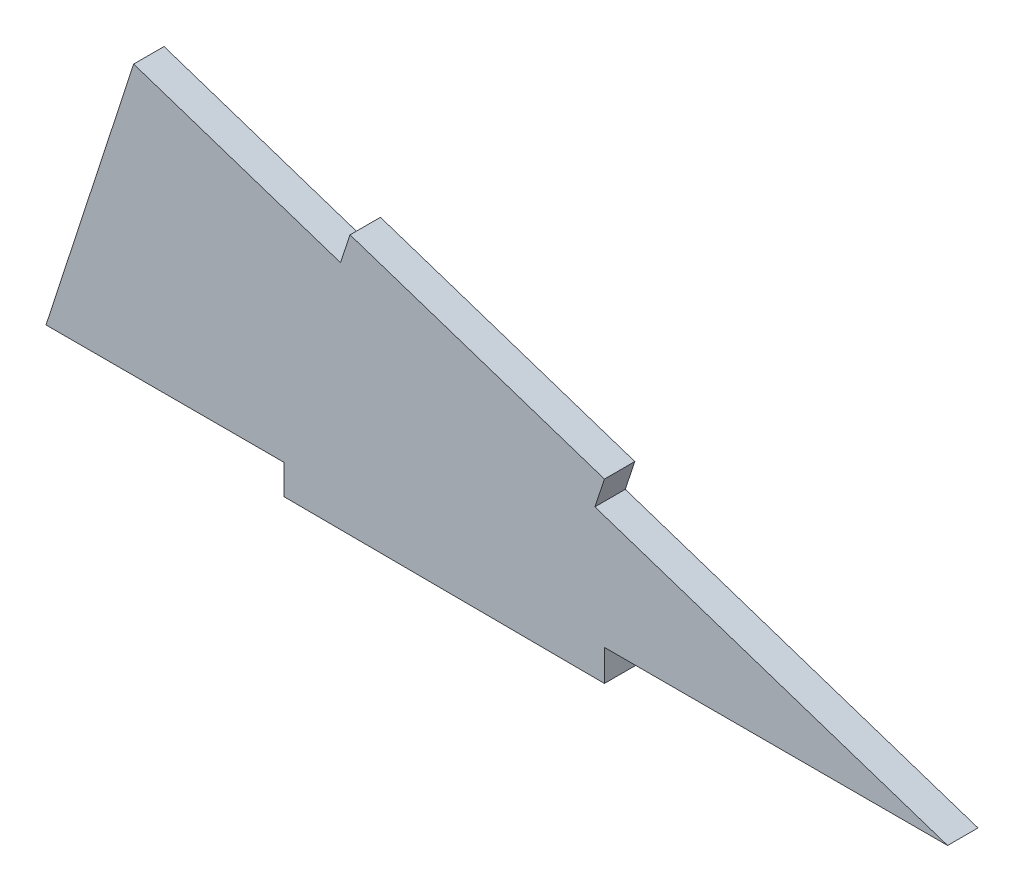
ISO-10303-21;
HEADER;
FILE_DESCRIPTION(('STEP AP214'),'2;1');
FILE_NAME('part.step','',(''),(''),'','','');
FILE_SCHEMA(('AUTOMOTIVE_DESIGN { 1 0 10303 214 1 1 1 1 }'));
ENDSEC;
DATA;
#1=APPLICATION_CONTEXT('core data for automotive mechanical design processes');
#2=APPLICATION_PROTOCOL_DEFINITION('international standard','automotive_design',2000,#1);
#3=PRODUCT_CONTEXT('',#1,'mechanical');
#4=PRODUCT('Part','Part','',(#3));
#5=PRODUCT_RELATED_PRODUCT_CATEGORY('part','',(#4));
#6=PRODUCT_DEFINITION_FORMATION('','',#4);
#7=PRODUCT_DEFINITION_CONTEXT('part definition',#1,'design');
#8=PRODUCT_DEFINITION('design','',#6,#7);
#9=PRODUCT_DEFINITION_SHAPE('','',#8);
#10=(LENGTH_UNIT() NAMED_UNIT(*) SI_UNIT(.MILLI.,.METRE.));
#11=(NAMED_UNIT(*) PLANE_ANGLE_UNIT() SI_UNIT($,.RADIAN.));
#12=(NAMED_UNIT(*) SI_UNIT($,.STERADIAN.) SOLID_ANGLE_UNIT());
#13=UNCERTAINTY_MEASURE_WITH_UNIT(LENGTH_MEASURE(1.E-05),#10,'distance_accuracy_value','');
#14=(GEOMETRIC_REPRESENTATION_CONTEXT(3) GLOBAL_UNCERTAINTY_ASSIGNED_CONTEXT((#13)) GLOBAL_UNIT_ASSIGNED_CONTEXT((#10,
#11,#12)) REPRESENTATION_CONTEXT('',''));
#15=CARTESIAN_POINT('',(0.,0.,0.));
#16=DIRECTION('',(0.,0.,1.));
#17=DIRECTION('',(1.,0.,0.));
#18=AXIS2_PLACEMENT_3D('',#15,#16,#17);
#19=CARTESIAN_POINT('',(-80.3475241575014,26.6295824562643,3.));
#20=DIRECTION('',(-0.314601307837959,-0.949223902515442,0.));
#21=DIRECTION('',(0.949223902515442,-0.314601307837959,0.));
#22=AXIS2_PLACEMENT_3D('',#19,#20,#21);
#23=PLANE('',#22);
#24=DIRECTION('',(-0.949223902515442,0.314601307837959,0.));
#25=VECTOR('',#24,1.);
#26=CARTESIAN_POINT('',(-80.3475241575014,26.6295824562643,3.));
#27=LINE('',#26,#25);
#28=CARTESIAN_POINT('',(-59.9311167076422,19.8629718936169,3.));
#29=VERTEX_POINT('',#28);
#30=CARTESIAN_POINT('',(-80.3475241575014,26.6295824562643,3.));
#31=VERTEX_POINT('',#30);
#32=EDGE_CURVE('E48',#29,#31,#27,.T.);
#33=ORIENTED_EDGE('',*,*,#32,.F.);
#34=DIRECTION('',(0.,0.,1.));
#35=VECTOR('',#34,1.);
#36=CARTESIAN_POINT('',(-59.9311167076422,19.8629718936169,0.));
#37=LINE('',#36,#35);
#38=CARTESIAN_POINT('',(-59.9311167076422,19.8629718936169,0.));
#39=VERTEX_POINT('',#38);
#40=EDGE_CURVE('E149',#39,#29,#37,.T.);
#41=ORIENTED_EDGE('',*,*,#40,.F.);
#42=DIRECTION('',(-0.949223902515442,0.314601307837959,0.));
#43=VECTOR('',#42,1.);
#44=CARTESIAN_POINT('',(-80.3475241575014,26.6295824562643,0.));
#45=LINE('',#44,#43);
#46=CARTESIAN_POINT('',(-80.3475241575014,26.6295824562643,0.));
#47=VERTEX_POINT('',#46);
#48=EDGE_CURVE('E173',#39,#47,#45,.T.);
#49=ORIENTED_EDGE('',*,*,#48,.T.);
#50=DIRECTION('',(0.,0.,-1.));
#51=VECTOR('',#50,1.);
#52=CARTESIAN_POINT('',(-80.3475241575014,26.6295824562643,3.));
#53=LINE('',#52,#51);
#54=EDGE_CURVE('E11',#31,#47,#53,.T.);
#55=ORIENTED_EDGE('',*,*,#54,.F.);
#56=EDGE_LOOP('',(#33,#41,#49,#55));
#57=FACE_BOUND('',#56,.T.);
#58=ADVANCED_FACE('F33',(#57),#23,.F.);
#59=CARTESIAN_POINT('',(0.,0.,3.));
#60=DIRECTION('',(0.,1.,0.));
#61=DIRECTION('',(-1.,0.,0.));
#62=AXIS2_PLACEMENT_3D('',#59,#60,#61);
#63=PLANE('',#62);
#64=DIRECTION('',(0.,0.,1.));
#65=VECTOR('',#64,1.);
#66=CARTESIAN_POINT('',(-33.8743450637499,0.,0.));
#67=LINE('',#66,#65);
#68=CARTESIAN_POINT('',(-33.8743450637499,0.,0.));
#69=VERTEX_POINT('',#68);
#70=CARTESIAN_POINT('',(-33.8743450637499,0.,3.));
#71=VERTEX_POINT('',#70);
#72=EDGE_CURVE('E171',#69,#71,#67,.T.);
#73=ORIENTED_EDGE('',*,*,#72,.F.);
#74=DIRECTION('',(1.,0.,0.));
#75=VECTOR('',#74,1.);
#76=CARTESIAN_POINT('',(0.,0.,0.));
#77=LINE('',#76,#75);
#78=CARTESIAN_POINT('',(0.,0.,0.));
#79=VERTEX_POINT('',#78);
#80=EDGE_CURVE('E193',#69,#79,#77,.T.);
#81=ORIENTED_EDGE('',*,*,#80,.T.);
#82=DIRECTION('',(0.,0.,-1.));
#83=VECTOR('',#82,1.);
#84=CARTESIAN_POINT('',(0.,0.,3.));
#85=LINE('',#84,#83);
#86=CARTESIAN_POINT('',(0.,0.,3.));
#87=VERTEX_POINT('',#86);
#88=EDGE_CURVE('E188',#87,#79,#85,.T.);
#89=ORIENTED_EDGE('',*,*,#88,.F.);
#90=DIRECTION('',(1.,0.,0.));
#91=VECTOR('',#90,1.);
#92=CARTESIAN_POINT('',(0.,0.,3.));
#93=LINE('',#92,#91);
#94=EDGE_CURVE('E184',#71,#87,#93,.T.);
#95=ORIENTED_EDGE('',*,*,#94,.F.);
#96=EDGE_LOOP('',(#73,#81,#89,#95));
#97=FACE_BOUND('',#96,.T.);
#98=ADVANCED_FACE('F224',(#97),#63,.F.);
#99=CARTESIAN_POINT('',(-34.8181489872637,11.5397802129323,0.));
#100=VERTEX_POINT('',#99);
#101=EDGE_CURVE('E189',#79,#100,#45,.T.);
#102=ORIENTED_EDGE('',*,*,#101,.T.);
#103=DIRECTION('',(0.,0.,1.));
#104=VECTOR('',#103,1.);
#105=CARTESIAN_POINT('',(-34.8181489872638,11.5397802129323,0.));
#106=LINE('',#105,#104);
#107=CARTESIAN_POINT('',(-34.8181489872637,11.5397802129323,3.));
#108=VERTEX_POINT('',#107);
#109=EDGE_CURVE('E56',#100,#108,#106,.T.);
#110=ORIENTED_EDGE('',*,*,#109,.T.);
#111=EDGE_CURVE('E180',#87,#108,#27,.T.);
#112=ORIENTED_EDGE('',*,*,#111,.F.);
#113=ORIENTED_EDGE('',*,*,#88,.T.);
#114=EDGE_LOOP('',(#102,#110,#112,#113));
#115=FACE_BOUND('',#114,.T.);
#116=ADVANCED_FACE('F35',(#115),#23,.F.);
#117=CARTESIAN_POINT('',(-89.,0.,3.));
#118=DIRECTION('',(0.951056516295152,-0.309016994374952,0.));
#119=DIRECTION('',(0.309016994374952,0.951056516295152,0.));
#120=AXIS2_PLACEMENT_3D('',#117,#118,#119);
#121=PLANE('',#120);
#122=DIRECTION('',(-0.309016994374952,-0.951056516295152,0.));
#123=VECTOR('',#122,1.);
#124=CARTESIAN_POINT('',(-89.,0.,0.));
#125=LINE('',#124,#123);
#126=CARTESIAN_POINT('',(-89.,0.,0.));
#127=VERTEX_POINT('',#126);
#128=EDGE_CURVE('E191',#47,#127,#125,.T.);
#129=ORIENTED_EDGE('',*,*,#128,.T.);
#130=DIRECTION('',(0.,0.,-1.));
#131=VECTOR('',#130,1.);
#132=CARTESIAN_POINT('',(-89.,0.,3.));
#133=LINE('',#132,#131);
#134=CARTESIAN_POINT('',(-89.,0.,3.));
#135=VERTEX_POINT('',#134);
#136=EDGE_CURVE('E41',#135,#127,#133,.T.);
#137=ORIENTED_EDGE('',*,*,#136,.F.);
#138=DIRECTION('',(-0.309016994374952,-0.951056516295152,0.));
#139=VECTOR('',#138,1.);
#140=CARTESIAN_POINT('',(-89.,0.,3.));
#141=LINE('',#140,#139);
#142=EDGE_CURVE('E182',#31,#135,#141,.T.);
#143=ORIENTED_EDGE('',*,*,#142,.F.);
#144=ORIENTED_EDGE('',*,*,#54,.T.);
#145=EDGE_LOOP('',(#129,#137,#143,#144));
#146=FACE_BOUND('',#145,.T.);
#147=ADVANCED_FACE('F215',(#146),#121,.F.);
#148=CARTESIAN_POINT('',(-65.5271895856265,0.,0.));
#149=VERTEX_POINT('',#148);
#150=EDGE_CURVE('E194',#127,#149,#77,.T.);
#151=ORIENTED_EDGE('',*,*,#150,.T.);
#152=DIRECTION('',(0.,0.,1.));
#153=VECTOR('',#152,1.);
#154=CARTESIAN_POINT('',(-65.5271895856265,0.,0.));
#155=LINE('',#154,#153);
#156=CARTESIAN_POINT('',(-65.5271895856265,0.,3.));
#157=VERTEX_POINT('',#156);
#158=EDGE_CURVE('E163',#149,#157,#155,.T.);
#159=ORIENTED_EDGE('',*,*,#158,.T.);
#160=EDGE_CURVE('E185',#135,#157,#93,.T.);
#161=ORIENTED_EDGE('',*,*,#160,.F.);
#162=ORIENTED_EDGE('',*,*,#136,.T.);
#163=EDGE_LOOP('',(#151,#159,#161,#162));
#164=FACE_BOUND('',#163,.T.);
#165=ADVANCED_FACE('F203',(#164),#63,.F.);
#166=CARTESIAN_POINT('',(0.,0.,3.));
#167=DIRECTION('',(0.,0.,1.));
#168=DIRECTION('',(1.,0.,0.));
#169=AXIS2_PLACEMENT_3D('',#166,#167,#168);
#170=PLANE('',#169);
#171=ORIENTED_EDGE('',*,*,#111,.T.);
#172=DIRECTION('',(0.314601307837959,0.949223902515442,0.));
#173=VECTOR('',#172,1.);
#174=CARTESIAN_POINT('',(-33.8743450637499,14.3874519204786,3.));
#175=LINE('',#174,#173);
#176=CARTESIAN_POINT('',(-33.8743450637499,14.3874519204786,3.));
#177=VERTEX_POINT('',#176);
#178=EDGE_CURVE('E146',#108,#177,#175,.T.);
#179=ORIENTED_EDGE('',*,*,#178,.T.);
#180=DIRECTION('',(-0.949223902515442,0.314601307837959,0.));
#181=VECTOR('',#180,1.);
#182=CARTESIAN_POINT('',(-58.9873127841283,22.7106436011632,3.));
#183=LINE('',#182,#181);
#184=CARTESIAN_POINT('',(-58.9873127841283,22.7106436011632,3.));
#185=VERTEX_POINT('',#184);
#186=EDGE_CURVE('E124',#177,#185,#183,.T.);
#187=ORIENTED_EDGE('',*,*,#186,.T.);
#188=DIRECTION('',(-0.314601307837959,-0.949223902515442,0.));
#189=VECTOR('',#188,1.);
#190=CARTESIAN_POINT('',(-59.9311167076422,19.8629718936169,3.));
#191=LINE('',#190,#189);
#192=EDGE_CURVE('E140',#185,#29,#191,.T.);
#193=ORIENTED_EDGE('',*,*,#192,.T.);
#194=ORIENTED_EDGE('',*,*,#32,.T.);
#195=ORIENTED_EDGE('',*,*,#142,.T.);
#196=ORIENTED_EDGE('',*,*,#160,.T.);
#197=DIRECTION('',(0.,-1.,0.));
#198=VECTOR('',#197,1.);
#199=CARTESIAN_POINT('',(-65.5271895856265,0.,3.));
#200=LINE('',#199,#198);
#201=CARTESIAN_POINT('',(-65.5271895856265,-2.93386052175866,3.));
#202=VERTEX_POINT('',#201);
#203=EDGE_CURVE('E151',#157,#202,#200,.T.);
#204=ORIENTED_EDGE('',*,*,#203,.T.);
#205=DIRECTION('',(0.999988265666315,-0.00484443285385099,0.));
#206=VECTOR('',#205,1.);
#207=CARTESIAN_POINT('',(-65.5271895856265,-2.93386052175866,3.));
#208=LINE('',#207,#206);
#209=CARTESIAN_POINT('',(-33.8743450637499,-3.08720240104305,3.));
#210=VERTEX_POINT('',#209);
#211=EDGE_CURVE('E166',#202,#210,#208,.T.);
#212=ORIENTED_EDGE('',*,*,#211,.T.);
#213=DIRECTION('',(0.,1.,0.));
#214=VECTOR('',#213,1.);
#215=CARTESIAN_POINT('',(-33.8743450637499,-3.08720240104305,3.));
#216=LINE('',#215,#214);
#217=EDGE_CURVE('E158',#210,#71,#216,.T.);
#218=ORIENTED_EDGE('',*,*,#217,.T.);
#219=ORIENTED_EDGE('',*,*,#94,.T.);
#220=EDGE_LOOP('',(#171,#179,#187,#193,#194,#195,#196,#204,#212,#218,#219));
#221=FACE_BOUND('',#220,.T.);
#222=ADVANCED_FACE('F214',(#221),#170,.T.);
#223=CARTESIAN_POINT('',(0.,0.,0.));
#224=DIRECTION('',(0.,0.,1.));
#225=DIRECTION('',(1.,0.,0.));
#226=AXIS2_PLACEMENT_3D('',#223,#224,#225);
#227=PLANE('',#226);
#228=ORIENTED_EDGE('',*,*,#101,.F.);
#229=ORIENTED_EDGE('',*,*,#80,.F.);
#230=DIRECTION('',(0.,1.,0.));
#231=VECTOR('',#230,1.);
#232=CARTESIAN_POINT('',(-33.8743450637499,-3.08720240104305,0.));
#233=LINE('',#232,#231);
#234=CARTESIAN_POINT('',(-33.8743450637499,-3.08720240104305,0.));
#235=VERTEX_POINT('',#234);
#236=EDGE_CURVE('E161',#235,#69,#233,.T.);
#237=ORIENTED_EDGE('',*,*,#236,.F.);
#238=DIRECTION('',(0.999988265666315,-0.00484443285385099,0.));
#239=VECTOR('',#238,1.);
#240=CARTESIAN_POINT('',(-65.5271895856265,-2.93386052175866,0.));
#241=LINE('',#240,#239);
#242=CARTESIAN_POINT('',(-65.5271895856265,-2.93386052175866,0.));
#243=VERTEX_POINT('',#242);
#244=EDGE_CURVE('E157',#243,#235,#241,.T.);
#245=ORIENTED_EDGE('',*,*,#244,.F.);
#246=DIRECTION('',(0.,-1.,0.));
#247=VECTOR('',#246,1.);
#248=CARTESIAN_POINT('',(-65.5271895856265,0.,0.));
#249=LINE('',#248,#247);
#250=EDGE_CURVE('E154',#149,#243,#249,.T.);
#251=ORIENTED_EDGE('',*,*,#250,.F.);
#252=ORIENTED_EDGE('',*,*,#150,.F.);
#253=ORIENTED_EDGE('',*,*,#128,.F.);
#254=ORIENTED_EDGE('',*,*,#48,.F.);
#255=DIRECTION('',(-0.314601307837959,-0.949223902515442,0.));
#256=VECTOR('',#255,1.);
#257=CARTESIAN_POINT('',(-59.9311167076422,19.8629718936169,0.));
#258=LINE('',#257,#256);
#259=CARTESIAN_POINT('',(-58.9873127841283,22.7106436011632,0.));
#260=VERTEX_POINT('',#259);
#261=EDGE_CURVE('E137',#260,#39,#258,.T.);
#262=ORIENTED_EDGE('',*,*,#261,.F.);
#263=DIRECTION('',(-0.949223902515442,0.314601307837959,0.));
#264=VECTOR('',#263,1.);
#265=CARTESIAN_POINT('',(-58.9873127841283,22.7106436011632,0.));
#266=LINE('',#265,#264);
#267=CARTESIAN_POINT('',(-33.8743450637499,14.3874519204786,0.));
#268=VERTEX_POINT('',#267);
#269=EDGE_CURVE('E121',#268,#260,#266,.T.);
#270=ORIENTED_EDGE('',*,*,#269,.F.);
#271=DIRECTION('',(0.314601307837959,0.949223902515442,0.));
#272=VECTOR('',#271,1.);
#273=CARTESIAN_POINT('',(-33.8743450637499,14.3874519204786,0.));
#274=LINE('',#273,#272);
#275=EDGE_CURVE('E135',#100,#268,#274,.T.);
#276=ORIENTED_EDGE('',*,*,#275,.F.);
#277=EDGE_LOOP('',(#228,#229,#237,#245,#251,#252,#253,#254,#262,#270,#276));
#278=FACE_BOUND('',#277,.T.);
#279=ADVANCED_FACE('F134',(#278),#227,.F.);
#280=CARTESIAN_POINT('',(-33.8743450637499,-3.08720240104305,0.));
#281=DIRECTION('',(1.,0.,0.));
#282=DIRECTION('',(0.,0.,-1.));
#283=AXIS2_PLACEMENT_3D('',#280,#281,#282);
#284=PLANE('',#283);
#285=ORIENTED_EDGE('',*,*,#217,.F.);
#286=DIRECTION('',(0.,0.,1.));
#287=VECTOR('',#286,1.);
#288=CARTESIAN_POINT('',(-33.8743450637499,-3.08720240104305,0.));
#289=LINE('',#288,#287);
#290=EDGE_CURVE('E174',#235,#210,#289,.T.);
#291=ORIENTED_EDGE('',*,*,#290,.F.);
#292=ORIENTED_EDGE('',*,*,#236,.T.);
#293=ORIENTED_EDGE('',*,*,#72,.T.);
#294=EDGE_LOOP('',(#285,#291,#292,#293));
#295=FACE_BOUND('',#294,.T.);
#296=ADVANCED_FACE('F227',(#295),#284,.T.);
#297=CARTESIAN_POINT('',(-65.5271895856265,-2.93386052175866,0.));
#298=DIRECTION('',(-0.00484443285385099,-0.999988265666315,0.));
#299=DIRECTION('',(0.999988265666315,-0.00484443285385099,0.));
#300=AXIS2_PLACEMENT_3D('',#297,#298,#299);
#301=PLANE('',#300);
#302=ORIENTED_EDGE('',*,*,#211,.F.);
#303=DIRECTION('',(0.,0.,1.));
#304=VECTOR('',#303,1.);
#305=CARTESIAN_POINT('',(-65.5271895856265,-2.93386052175866,0.));
#306=LINE('',#305,#304);
#307=EDGE_CURVE('E176',#243,#202,#306,.T.);
#308=ORIENTED_EDGE('',*,*,#307,.F.);
#309=ORIENTED_EDGE('',*,*,#244,.T.);
#310=ORIENTED_EDGE('',*,*,#290,.T.);
#311=EDGE_LOOP('',(#302,#308,#309,#310));
#312=FACE_BOUND('',#311,.T.);
#313=ADVANCED_FACE('F229',(#312),#301,.T.);
#314=CARTESIAN_POINT('',(-65.5271895856265,0.,0.));
#315=DIRECTION('',(-1.,0.,0.));
#316=DIRECTION('',(0.,-1.,0.));
#317=AXIS2_PLACEMENT_3D('',#314,#315,#316);
#318=PLANE('',#317);
#319=ORIENTED_EDGE('',*,*,#203,.F.);
#320=ORIENTED_EDGE('',*,*,#158,.F.);
#321=ORIENTED_EDGE('',*,*,#250,.T.);
#322=ORIENTED_EDGE('',*,*,#307,.T.);
#323=EDGE_LOOP('',(#319,#320,#321,#322));
#324=FACE_BOUND('',#323,.T.);
#325=ADVANCED_FACE('F211',(#324),#318,.T.);
#326=CARTESIAN_POINT('',(-59.9311167076422,19.8629718936169,0.));
#327=DIRECTION('',(-0.949223902515442,0.31460130783796,0.));
#328=DIRECTION('',(-0.314601307837959,-0.949223902515442,0.));
#329=AXIS2_PLACEMENT_3D('',#326,#327,#328);
#330=PLANE('',#329);
#331=ORIENTED_EDGE('',*,*,#192,.F.);
#332=DIRECTION('',(0.,0.,1.));
#333=VECTOR('',#332,1.);
#334=CARTESIAN_POINT('',(-58.9873127841283,22.7106436011632,0.));
#335=LINE('',#334,#333);
#336=EDGE_CURVE('E129',#260,#185,#335,.T.);
#337=ORIENTED_EDGE('',*,*,#336,.F.);
#338=ORIENTED_EDGE('',*,*,#261,.T.);
#339=ORIENTED_EDGE('',*,*,#40,.T.);
#340=EDGE_LOOP('',(#331,#337,#338,#339));
#341=FACE_BOUND('',#340,.T.);
#342=ADVANCED_FACE('F218',(#341),#330,.T.);
#343=CARTESIAN_POINT('',(-58.9873127841283,22.7106436011632,0.));
#344=DIRECTION('',(0.314601307837959,0.949223902515442,0.));
#345=DIRECTION('',(-0.949223902515443,0.314601307837959,0.));
#346=AXIS2_PLACEMENT_3D('',#343,#344,#345);
#347=PLANE('',#346);
#348=ORIENTED_EDGE('',*,*,#186,.F.);
#349=DIRECTION('',(0.,0.,1.));
#350=VECTOR('',#349,1.);
#351=CARTESIAN_POINT('',(-33.8743450637499,14.3874519204786,0.));
#352=LINE('',#351,#350);
#353=EDGE_CURVE('E118',#268,#177,#352,.T.);
#354=ORIENTED_EDGE('',*,*,#353,.F.);
#355=ORIENTED_EDGE('',*,*,#269,.T.);
#356=ORIENTED_EDGE('',*,*,#336,.T.);
#357=EDGE_LOOP('',(#348,#354,#355,#356));
#358=FACE_BOUND('',#357,.T.);
#359=ADVANCED_FACE('F120',(#358),#347,.T.);
#360=CARTESIAN_POINT('',(-33.8743450637499,14.3874519204786,0.));
#361=DIRECTION('',(0.949223902515442,-0.314601307837959,0.));
#362=DIRECTION('',(0.314601307837959,0.949223902515442,0.));
#363=AXIS2_PLACEMENT_3D('',#360,#361,#362);
#364=PLANE('',#363);
#365=ORIENTED_EDGE('',*,*,#178,.F.);
#366=ORIENTED_EDGE('',*,*,#109,.F.);
#367=ORIENTED_EDGE('',*,*,#275,.T.);
#368=ORIENTED_EDGE('',*,*,#353,.T.);
#369=EDGE_LOOP('',(#365,#366,#367,#368));
#370=FACE_BOUND('',#369,.T.);
#371=ADVANCED_FACE('F139',(#370),#364,.T.);
#372=CLOSED_SHELL('',(#58,#98,#116,#147,#165,#222,#279,#296,#313,#325,#342,#359,#371));
#373=MANIFOLD_SOLID_BREP('B2',#372);
#374=ADVANCED_BREP_SHAPE_REPRESENTATION('',(#18,#373),#14);
#375=SHAPE_DEFINITION_REPRESENTATION(#9,#374);
ENDSEC;
END-ISO-10303-21;
